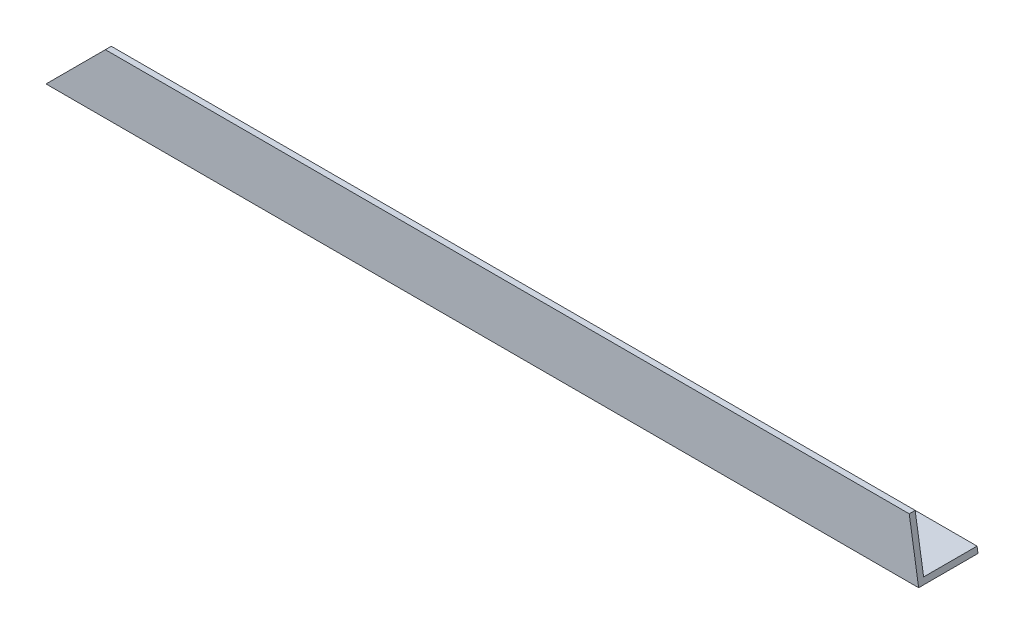
ISO-10303-21;
HEADER;
FILE_DESCRIPTION(('STEP AP214'),'2;1');
FILE_NAME('part.step','',(''),(''),'','','');
FILE_SCHEMA(('AUTOMOTIVE_DESIGN { 1 0 10303 214 1 1 1 1 }'));
ENDSEC;
DATA;
#1=APPLICATION_CONTEXT('core data for automotive mechanical design processes');
#2=APPLICATION_PROTOCOL_DEFINITION('international standard','automotive_design',2000,#1);
#3=PRODUCT_CONTEXT('',#1,'mechanical');
#4=PRODUCT('Part','Part','',(#3));
#5=PRODUCT_RELATED_PRODUCT_CATEGORY('part','',(#4));
#6=PRODUCT_DEFINITION_FORMATION('','',#4);
#7=PRODUCT_DEFINITION_CONTEXT('part definition',#1,'design');
#8=PRODUCT_DEFINITION('design','',#6,#7);
#9=PRODUCT_DEFINITION_SHAPE('','',#8);
#10=(LENGTH_UNIT() NAMED_UNIT(*) SI_UNIT(.MILLI.,.METRE.));
#11=(NAMED_UNIT(*) PLANE_ANGLE_UNIT() SI_UNIT($,.RADIAN.));
#12=(NAMED_UNIT(*) SI_UNIT($,.STERADIAN.) SOLID_ANGLE_UNIT());
#13=UNCERTAINTY_MEASURE_WITH_UNIT(LENGTH_MEASURE(1.E-05),#10,'distance_accuracy_value','');
#14=(GEOMETRIC_REPRESENTATION_CONTEXT(3) GLOBAL_UNCERTAINTY_ASSIGNED_CONTEXT((#13)) GLOBAL_UNIT_ASSIGNED_CONTEXT((#10,
#11,#12)) REPRESENTATION_CONTEXT('',''));
#15=CARTESIAN_POINT('',(0.,0.,0.));
#16=DIRECTION('',(0.,0.,1.));
#17=DIRECTION('',(1.,0.,0.));
#18=AXIS2_PLACEMENT_3D('',#15,#16,#17);
#19=CARTESIAN_POINT('',(294.,20.,0.));
#20=DIRECTION('',(0.,-1.,0.));
#21=DIRECTION('',(0.,0.,-1.));
#22=AXIS2_PLACEMENT_3D('',#19,#20,#21);
#23=PLANE('',#22);
#24=DIRECTION('',(0.,0.,1.));
#25=VECTOR('',#24,1.);
#26=CARTESIAN_POINT('',(19.9999999999998,20.,-20.));
#27=LINE('',#26,#25);
#28=CARTESIAN_POINT('',(19.9999999999998,20.,-2.));
#29=VERTEX_POINT('',#28);
#30=CARTESIAN_POINT('',(19.9999999999998,20.,0.));
#31=VERTEX_POINT('',#30);
#32=EDGE_CURVE('E89',#29,#31,#27,.T.);
#33=ORIENTED_EDGE('',*,*,#32,.T.);
#34=DIRECTION('',(-1.,0.,0.));
#35=VECTOR('',#34,1.);
#36=CARTESIAN_POINT('',(294.,20.,0.));
#37=LINE('',#36,#35);
#38=CARTESIAN_POINT('',(290.832311193509,20.,0.));
#39=VERTEX_POINT('',#38);
#40=EDGE_CURVE('E11',#39,#31,#37,.T.);
#41=ORIENTED_EDGE('',*,*,#40,.F.);
#42=DIRECTION('',(0.,0.,1.));
#43=VECTOR('',#42,1.);
#44=CARTESIAN_POINT('',(290.832311193509,20.,-20.));
#45=LINE('',#44,#43);
#46=CARTESIAN_POINT('',(290.832311193509,20.,-2.));
#47=VERTEX_POINT('',#46);
#48=EDGE_CURVE('E109',#47,#39,#45,.T.);
#49=ORIENTED_EDGE('',*,*,#48,.F.);
#50=DIRECTION('',(-1.,0.,0.));
#51=VECTOR('',#50,1.);
#52=CARTESIAN_POINT('',(294.,20.,-2.));
#53=LINE('',#52,#51);
#54=EDGE_CURVE('E102',#47,#29,#53,.T.);
#55=ORIENTED_EDGE('',*,*,#54,.T.);
#56=EDGE_LOOP('',(#33,#41,#49,#55));
#57=FACE_BOUND('',#56,.T.);
#58=ADVANCED_FACE('F39',(#57),#23,.F.);
#59=CARTESIAN_POINT('',(294.,20.,0.));
#60=DIRECTION('',(0.,0.,-1.));
#61=DIRECTION('',(-1.,0.,0.));
#62=AXIS2_PLACEMENT_3D('',#59,#60,#61);
#63=PLANE('',#62);
#64=DIRECTION('',(-0.707106781186544,-0.707106781186551,0.));
#65=VECTOR('',#64,1.);
#66=CARTESIAN_POINT('',(0.,0.,0.));
#67=LINE('',#66,#65);
#68=CARTESIAN_POINT('',(0.,0.,0.));
#69=VERTEX_POINT('',#68);
#70=EDGE_CURVE('E86',#31,#69,#67,.T.);
#71=ORIENTED_EDGE('',*,*,#70,.T.);
#72=DIRECTION('',(-1.,0.,0.));
#73=VECTOR('',#72,1.);
#74=CARTESIAN_POINT('',(294.,0.,0.));
#75=LINE('',#74,#73);
#76=CARTESIAN_POINT('',(294.,0.,0.));
#77=VERTEX_POINT('',#76);
#78=EDGE_CURVE('E47',#77,#69,#75,.T.);
#79=ORIENTED_EDGE('',*,*,#78,.F.);
#80=DIRECTION('',(-0.156434465040225,0.987688340595139,0.));
#81=VECTOR('',#80,1.);
#82=CARTESIAN_POINT('',(294.,0.,0.));
#83=LINE('',#82,#81);
#84=EDGE_CURVE('E53',#77,#39,#83,.T.);
#85=ORIENTED_EDGE('',*,*,#84,.T.);
#86=ORIENTED_EDGE('',*,*,#40,.T.);
#87=EDGE_LOOP('',(#71,#79,#85,#86));
#88=FACE_BOUND('',#87,.T.);
#89=ADVANCED_FACE('F105',(#88),#63,.F.);
#90=CARTESIAN_POINT('',(294.,0.,-20.));
#91=DIRECTION('',(0.,0.,1.));
#92=DIRECTION('',(1.,0.,0.));
#93=AXIS2_PLACEMENT_3D('',#90,#91,#92);
#94=PLANE('',#93);
#95=DIRECTION('',(-0.707106781186544,-0.707106781186551,0.));
#96=VECTOR('',#95,1.);
#97=CARTESIAN_POINT('',(0.,0.,-20.));
#98=LINE('',#97,#96);
#99=CARTESIAN_POINT('',(1.99999999999995,1.99999999999999,-20.));
#100=VERTEX_POINT('',#99);
#101=CARTESIAN_POINT('',(0.,0.,-20.));
#102=VERTEX_POINT('',#101);
#103=EDGE_CURVE('E95',#100,#102,#98,.T.);
#104=ORIENTED_EDGE('',*,*,#103,.F.);
#105=DIRECTION('',(-1.,0.,0.));
#106=VECTOR('',#105,1.);
#107=CARTESIAN_POINT('',(294.,2.,-20.));
#108=LINE('',#107,#106);
#109=CARTESIAN_POINT('',(293.683231119351,2.,-20.));
#110=VERTEX_POINT('',#109);
#111=EDGE_CURVE('E127',#110,#100,#108,.T.);
#112=ORIENTED_EDGE('',*,*,#111,.F.);
#113=DIRECTION('',(-0.156434465040225,0.987688340595139,0.));
#114=VECTOR('',#113,1.);
#115=CARTESIAN_POINT('',(294.,0.,-20.));
#116=LINE('',#115,#114);
#117=CARTESIAN_POINT('',(294.,0.,-20.));
#118=VERTEX_POINT('',#117);
#119=EDGE_CURVE('E107',#118,#110,#116,.T.);
#120=ORIENTED_EDGE('',*,*,#119,.F.);
#121=DIRECTION('',(-1.,0.,0.));
#122=VECTOR('',#121,1.);
#123=CARTESIAN_POINT('',(294.,0.,-20.));
#124=LINE('',#123,#122);
#125=EDGE_CURVE('E130',#118,#102,#124,.T.);
#126=ORIENTED_EDGE('',*,*,#125,.T.);
#127=EDGE_LOOP('',(#104,#112,#120,#126));
#128=FACE_BOUND('',#127,.T.);
#129=ADVANCED_FACE('F141',(#128),#94,.F.);
#130=CARTESIAN_POINT('',(294.,2.,-20.));
#131=DIRECTION('',(0.,-1.,0.));
#132=DIRECTION('',(0.,0.,-1.));
#133=AXIS2_PLACEMENT_3D('',#130,#131,#132);
#134=PLANE('',#133);
#135=DIRECTION('',(0.,0.,-1.));
#136=VECTOR('',#135,1.);
#137=CARTESIAN_POINT('',(2.,2.,-20.));
#138=LINE('',#137,#136);
#139=CARTESIAN_POINT('',(2.00000000000006,2.,-2.));
#140=VERTEX_POINT('',#139);
#141=EDGE_CURVE('E114',#140,#100,#138,.T.);
#142=ORIENTED_EDGE('',*,*,#141,.F.);
#143=DIRECTION('',(-1.,0.,0.));
#144=VECTOR('',#143,1.);
#145=CARTESIAN_POINT('',(294.,2.,-2.));
#146=LINE('',#145,#144);
#147=CARTESIAN_POINT('',(293.683231119351,2.,-2.));
#148=VERTEX_POINT('',#147);
#149=EDGE_CURVE('E124',#148,#140,#146,.T.);
#150=ORIENTED_EDGE('',*,*,#149,.F.);
#151=DIRECTION('',(0.,0.,1.));
#152=VECTOR('',#151,1.);
#153=CARTESIAN_POINT('',(293.683231119351,2.,-20.));
#154=LINE('',#153,#152);
#155=EDGE_CURVE('E118',#110,#148,#154,.T.);
#156=ORIENTED_EDGE('',*,*,#155,.F.);
#157=ORIENTED_EDGE('',*,*,#111,.T.);
#158=EDGE_LOOP('',(#142,#150,#156,#157));
#159=FACE_BOUND('',#158,.T.);
#160=ADVANCED_FACE('F144',(#159),#134,.F.);
#161=CARTESIAN_POINT('',(294.,2.,-2.));
#162=DIRECTION('',(0.,0.,1.));
#163=DIRECTION('',(0.,-1.,0.));
#164=AXIS2_PLACEMENT_3D('',#161,#162,#163);
#165=PLANE('',#164);
#166=DIRECTION('',(-0.707106781186544,-0.707106781186551,0.));
#167=VECTOR('',#166,1.);
#168=CARTESIAN_POINT('',(147.999999999999,148.,-2.00000000000001));
#169=LINE('',#168,#167);
#170=EDGE_CURVE('E103',#29,#140,#169,.T.);
#171=ORIENTED_EDGE('',*,*,#170,.F.);
#172=ORIENTED_EDGE('',*,*,#54,.F.);
#173=DIRECTION('',(-0.156434465040225,0.987688340595139,0.));
#174=VECTOR('',#173,1.);
#175=CARTESIAN_POINT('',(293.690983005625,1.95105651629516,-2.));
#176=LINE('',#175,#174);
#177=EDGE_CURVE('E116',#148,#47,#176,.T.);
#178=ORIENTED_EDGE('',*,*,#177,.F.);
#179=ORIENTED_EDGE('',*,*,#149,.T.);
#180=EDGE_LOOP('',(#171,#172,#178,#179));
#181=FACE_BOUND('',#180,.T.);
#182=ADVANCED_FACE('F148',(#181),#165,.F.);
#183=CARTESIAN_POINT('',(294.,0.,0.));
#184=DIRECTION('',(0.,1.,0.));
#185=DIRECTION('',(0.,0.,1.));
#186=AXIS2_PLACEMENT_3D('',#183,#184,#185);
#187=PLANE('',#186);
#188=DIRECTION('',(0.,0.,-1.));
#189=VECTOR('',#188,1.);
#190=CARTESIAN_POINT('',(0.,0.,0.));
#191=LINE('',#190,#189);
#192=EDGE_CURVE('E92',#69,#102,#191,.T.);
#193=ORIENTED_EDGE('',*,*,#192,.T.);
#194=ORIENTED_EDGE('',*,*,#125,.F.);
#195=DIRECTION('',(0.,0.,-1.));
#196=VECTOR('',#195,1.);
#197=CARTESIAN_POINT('',(294.,0.,0.));
#198=LINE('',#197,#196);
#199=EDGE_CURVE('E120',#77,#118,#198,.T.);
#200=ORIENTED_EDGE('',*,*,#199,.F.);
#201=ORIENTED_EDGE('',*,*,#78,.T.);
#202=EDGE_LOOP('',(#193,#194,#200,#201));
#203=FACE_BOUND('',#202,.T.);
#204=ADVANCED_FACE('F133',(#203),#187,.F.);
#205=CARTESIAN_POINT('',(0.,0.,-20.));
#206=DIRECTION('',(-0.707106781186551,0.707106781186544,0.));
#207=DIRECTION('',(-0.707106781186544,-0.707106781186551,0.));
#208=AXIS2_PLACEMENT_3D('',#205,#206,#207);
#209=PLANE('',#208);
#210=ORIENTED_EDGE('',*,*,#141,.T.);
#211=ORIENTED_EDGE('',*,*,#103,.T.);
#212=ORIENTED_EDGE('',*,*,#192,.F.);
#213=ORIENTED_EDGE('',*,*,#70,.F.);
#214=ORIENTED_EDGE('',*,*,#32,.F.);
#215=ORIENTED_EDGE('',*,*,#170,.T.);
#216=EDGE_LOOP('',(#210,#211,#212,#213,#214,#215));
#217=FACE_BOUND('',#216,.T.);
#218=ADVANCED_FACE('F88',(#217),#209,.T.);
#219=CARTESIAN_POINT('',(294.,0.,-20.));
#220=DIRECTION('',(0.987688340595139,0.156434465040225,0.));
#221=DIRECTION('',(-0.156434465040225,0.987688340595139,0.));
#222=AXIS2_PLACEMENT_3D('',#219,#220,#221);
#223=PLANE('',#222);
#224=ORIENTED_EDGE('',*,*,#155,.T.);
#225=ORIENTED_EDGE('',*,*,#177,.T.);
#226=ORIENTED_EDGE('',*,*,#48,.T.);
#227=ORIENTED_EDGE('',*,*,#84,.F.);
#228=ORIENTED_EDGE('',*,*,#199,.T.);
#229=ORIENTED_EDGE('',*,*,#119,.T.);
#230=EDGE_LOOP('',(#224,#225,#226,#227,#228,#229));
#231=FACE_BOUND('',#230,.T.);
#232=ADVANCED_FACE('F136',(#231),#223,.T.);
#233=CLOSED_SHELL('',(#58,#89,#129,#160,#182,#204,#218,#232));
#234=MANIFOLD_SOLID_BREP('B2',#233);
#235=ADVANCED_BREP_SHAPE_REPRESENTATION('',(#18,#234),#14);
#236=SHAPE_DEFINITION_REPRESENTATION(#9,#235);
ENDSEC;
END-ISO-10303-21;
